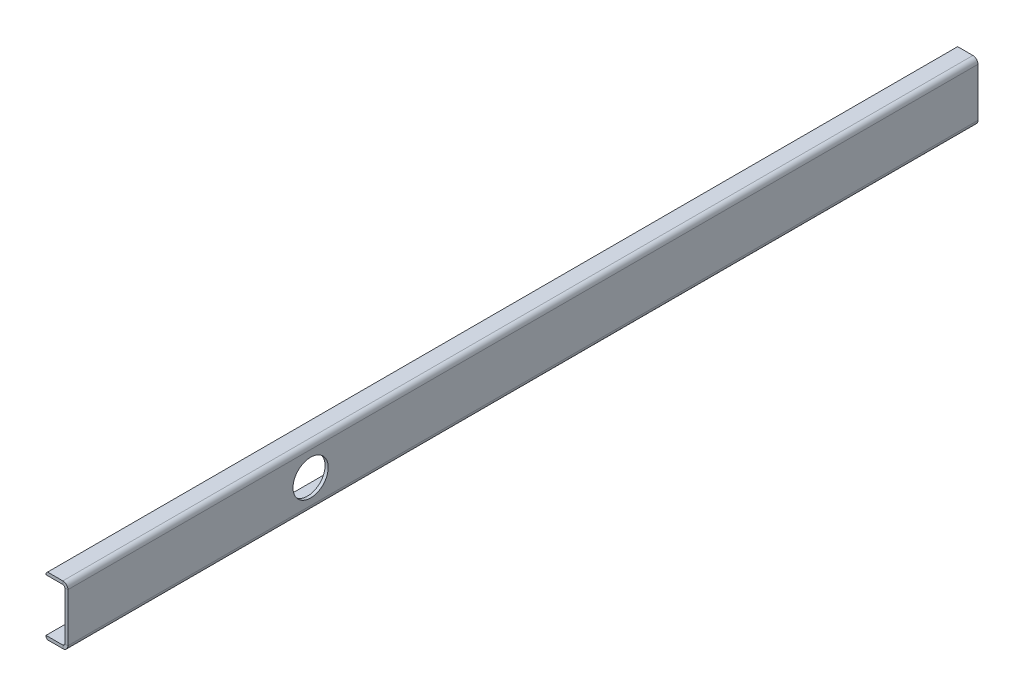
ISO-10303-21;
HEADER;
FILE_DESCRIPTION(('STEP AP214'),'2;1');
FILE_NAME('part.step','',(''),(''),'','','');
FILE_SCHEMA(('AUTOMOTIVE_DESIGN { 1 0 10303 214 1 1 1 1 }'));
ENDSEC;
DATA;
#1=APPLICATION_CONTEXT('core data for automotive mechanical design processes');
#2=APPLICATION_PROTOCOL_DEFINITION('international standard','automotive_design',2000,#1);
#3=PRODUCT_CONTEXT('',#1,'mechanical');
#4=PRODUCT('Part','Part','',(#3));
#5=PRODUCT_RELATED_PRODUCT_CATEGORY('part','',(#4));
#6=PRODUCT_DEFINITION_FORMATION('','',#4);
#7=PRODUCT_DEFINITION_CONTEXT('part definition',#1,'design');
#8=PRODUCT_DEFINITION('design','',#6,#7);
#9=PRODUCT_DEFINITION_SHAPE('','',#8);
#10=(LENGTH_UNIT() NAMED_UNIT(*) SI_UNIT(.MILLI.,.METRE.));
#11=(NAMED_UNIT(*) PLANE_ANGLE_UNIT() SI_UNIT($,.RADIAN.));
#12=(NAMED_UNIT(*) SI_UNIT($,.STERADIAN.) SOLID_ANGLE_UNIT());
#13=UNCERTAINTY_MEASURE_WITH_UNIT(LENGTH_MEASURE(1.E-05),#10,'distance_accuracy_value','');
#14=(GEOMETRIC_REPRESENTATION_CONTEXT(3) GLOBAL_UNCERTAINTY_ASSIGNED_CONTEXT((#13)) GLOBAL_UNIT_ASSIGNED_CONTEXT((#10,
#11,#12)) REPRESENTATION_CONTEXT('',''));
#15=CARTESIAN_POINT('',(0.,0.,0.));
#16=DIRECTION('',(0.,0.,1.));
#17=DIRECTION('',(1.,0.,0.));
#18=AXIS2_PLACEMENT_3D('',#15,#16,#17);
#19=CARTESIAN_POINT('',(56.,-13.,2325.));
#20=DIRECTION('',(0.,0.,1.));
#21=DIRECTION('',(1.,0.,0.));
#22=AXIS2_PLACEMENT_3D('',#19,#20,#21);
#23=PLANE('',#22);
#24=DIRECTION('',(-1.,0.,0.));
#25=VECTOR('',#24,1.);
#26=CARTESIAN_POINT('',(56.,-13.,2325.));
#27=LINE('',#26,#25);
#28=CARTESIAN_POINT('',(56.,-13.,2325.));
#29=VERTEX_POINT('',#28);
#30=CARTESIAN_POINT('',(48.,-13.,2325.));
#31=VERTEX_POINT('',#30);
#32=EDGE_CURVE('E184',#29,#31,#27,.T.);
#33=ORIENTED_EDGE('',*,*,#32,.F.);
#34=CARTESIAN_POINT('',(43.,-13.,2325.));
#35=DIRECTION('',(0.,0.,1.));
#36=DIRECTION('',(1.,0.,0.));
#37=AXIS2_PLACEMENT_3D('',#34,#35,#36);
#38=CIRCLE('',#37,13.);
#39=CARTESIAN_POINT('',(43.,0.,2325.));
#40=VERTEX_POINT('',#39);
#41=EDGE_CURVE('E293',#40,#29,#38,.F.);
#42=ORIENTED_EDGE('',*,*,#41,.F.);
#43=DIRECTION('',(0.,1.,0.));
#44=VECTOR('',#43,1.);
#45=CARTESIAN_POINT('',(43.,-8.,2325.));
#46=LINE('',#45,#44);
#47=CARTESIAN_POINT('',(43.,-8.,2325.));
#48=VERTEX_POINT('',#47);
#49=EDGE_CURVE('E181',#48,#40,#46,.T.);
#50=ORIENTED_EDGE('',*,*,#49,.F.);
#51=CARTESIAN_POINT('',(43.,-13.,2325.));
#52=DIRECTION('',(0.,0.,1.));
#53=DIRECTION('',(1.,0.,0.));
#54=AXIS2_PLACEMENT_3D('',#51,#52,#53);
#55=CIRCLE('',#54,5.);
#56=EDGE_CURVE('E284',#48,#31,#55,.F.);
#57=ORIENTED_EDGE('',*,*,#56,.T.);
#58=EDGE_LOOP('',(#33,#42,#50,#57));
#59=FACE_BOUND('',#58,.T.);
#60=ADVANCED_FACE('F38',(#59),#23,.T.);
#61=CARTESIAN_POINT('',(43.,-8.,2325.));
#62=DIRECTION('',(0.,0.,1.));
#63=DIRECTION('',(1.,0.,0.));
#64=AXIS2_PLACEMENT_3D('',#61,#62,#63);
#65=PLANE('',#64);
#66=DIRECTION('',(0.,-1.,0.));
#67=VECTOR('',#66,1.);
#68=CARTESIAN_POINT('',(56.,0.,2325.));
#69=LINE('',#68,#67);
#70=CARTESIAN_POINT('',(56.,-137.,2325.));
#71=VERTEX_POINT('',#70);
#72=EDGE_CURVE('E257',#29,#71,#69,.T.);
#73=ORIENTED_EDGE('',*,*,#72,.F.);
#74=ORIENTED_EDGE('',*,*,#32,.T.);
#75=DIRECTION('',(0.,-1.,0.));
#76=VECTOR('',#75,1.);
#77=CARTESIAN_POINT('',(48.,0.,2325.));
#78=LINE('',#77,#76);
#79=CARTESIAN_POINT('',(48.,-137.,2325.));
#80=VERTEX_POINT('',#79);
#81=EDGE_CURVE('E281',#31,#80,#78,.T.);
#82=ORIENTED_EDGE('',*,*,#81,.T.);
#83=DIRECTION('',(1.,0.,0.));
#84=VECTOR('',#83,1.);
#85=CARTESIAN_POINT('',(48.,-137.,2325.));
#86=LINE('',#85,#84);
#87=EDGE_CURVE('E174',#80,#71,#86,.T.);
#88=ORIENTED_EDGE('',*,*,#87,.T.);
#89=EDGE_LOOP('',(#73,#74,#82,#88));
#90=FACE_BOUND('',#89,.T.);
#91=ADVANCED_FACE('F331',(#90),#65,.T.);
#92=CARTESIAN_POINT('',(43.,0.,0.));
#93=DIRECTION('',(0.,0.,-1.));
#94=DIRECTION('',(-1.,0.,0.));
#95=AXIS2_PLACEMENT_3D('',#92,#93,#94);
#96=PLANE('',#95);
#97=DIRECTION('',(0.,-1.,0.));
#98=VECTOR('',#97,1.);
#99=CARTESIAN_POINT('',(43.,0.,0.));
#100=LINE('',#99,#98);
#101=CARTESIAN_POINT('',(43.,0.,0.));
#102=VERTEX_POINT('',#101);
#103=CARTESIAN_POINT('',(43.,-8.,0.));
#104=VERTEX_POINT('',#103);
#105=EDGE_CURVE('E179',#102,#104,#100,.T.);
#106=ORIENTED_EDGE('',*,*,#105,.F.);
#107=CARTESIAN_POINT('',(43.,-13.,0.));
#108=DIRECTION('',(0.,0.,1.));
#109=DIRECTION('',(1.,0.,0.));
#110=AXIS2_PLACEMENT_3D('',#107,#108,#109);
#111=CIRCLE('',#110,13.);
#112=CARTESIAN_POINT('',(56.,-13.,0.));
#113=VERTEX_POINT('',#112);
#114=EDGE_CURVE('E215',#102,#113,#111,.F.);
#115=ORIENTED_EDGE('',*,*,#114,.T.);
#116=DIRECTION('',(1.,0.,0.));
#117=VECTOR('',#116,1.);
#118=CARTESIAN_POINT('',(48.,-13.,0.));
#119=LINE('',#118,#117);
#120=CARTESIAN_POINT('',(48.,-13.,0.));
#121=VERTEX_POINT('',#120);
#122=EDGE_CURVE('E177',#121,#113,#119,.T.);
#123=ORIENTED_EDGE('',*,*,#122,.F.);
#124=CARTESIAN_POINT('',(43.,-13.,0.));
#125=DIRECTION('',(0.,0.,1.));
#126=DIRECTION('',(1.,0.,0.));
#127=AXIS2_PLACEMENT_3D('',#124,#125,#126);
#128=CIRCLE('',#127,5.);
#129=EDGE_CURVE('E213',#104,#121,#128,.F.);
#130=ORIENTED_EDGE('',*,*,#129,.F.);
#131=EDGE_LOOP('',(#106,#115,#123,#130));
#132=FACE_BOUND('',#131,.T.);
#133=ADVANCED_FACE('F337',(#132),#96,.T.);
#134=CARTESIAN_POINT('',(48.,-13.,0.));
#135=DIRECTION('',(0.,0.,-1.));
#136=DIRECTION('',(-1.,0.,0.));
#137=AXIS2_PLACEMENT_3D('',#134,#135,#136);
#138=PLANE('',#137);
#139=DIRECTION('',(0.,1.,0.));
#140=VECTOR('',#139,1.);
#141=CARTESIAN_POINT('',(0.,-8.,0.));
#142=LINE('',#141,#140);
#143=CARTESIAN_POINT('',(0.,-8.,0.));
#144=VERTEX_POINT('',#143);
#145=CARTESIAN_POINT('',(0.,-4.00000000000023,0.));
#146=VERTEX_POINT('',#145);
#147=EDGE_CURVE('E202',#144,#146,#142,.T.);
#148=ORIENTED_EDGE('',*,*,#147,.T.);
#149=DIRECTION('',(-0.707106781186548,-0.707106781186548,0.));
#150=VECTOR('',#149,1.);
#151=CARTESIAN_POINT('',(19.5000000000001,15.4999999999999,0.));
#152=LINE('',#151,#150);
#153=CARTESIAN_POINT('',(4.00000000000023,0.,0.));
#154=VERTEX_POINT('',#153);
#155=EDGE_CURVE('E60',#146,#154,#152,.F.);
#156=ORIENTED_EDGE('',*,*,#155,.T.);
#157=DIRECTION('',(1.,0.,0.));
#158=VECTOR('',#157,1.);
#159=CARTESIAN_POINT('',(0.,0.,0.));
#160=LINE('',#159,#158);
#161=EDGE_CURVE('E211',#154,#102,#160,.T.);
#162=ORIENTED_EDGE('',*,*,#161,.T.);
#163=ORIENTED_EDGE('',*,*,#105,.T.);
#164=DIRECTION('',(1.,0.,0.));
#165=VECTOR('',#164,1.);
#166=CARTESIAN_POINT('',(0.,-8.,0.));
#167=LINE('',#166,#165);
#168=EDGE_CURVE('E210',#144,#104,#167,.T.);
#169=ORIENTED_EDGE('',*,*,#168,.F.);
#170=EDGE_LOOP('',(#148,#156,#162,#163,#169));
#171=FACE_BOUND('',#170,.T.);
#172=ADVANCED_FACE('F208',(#171),#138,.T.);
#173=CARTESIAN_POINT('',(43.,-150.,2325.));
#174=DIRECTION('',(0.,0.,1.));
#175=DIRECTION('',(1.,0.,0.));
#176=AXIS2_PLACEMENT_3D('',#173,#174,#175);
#177=PLANE('',#176);
#178=DIRECTION('',(0.,1.,0.));
#179=VECTOR('',#178,1.);
#180=CARTESIAN_POINT('',(43.,-150.,2325.));
#181=LINE('',#180,#179);
#182=CARTESIAN_POINT('',(43.,-150.,2325.));
#183=VERTEX_POINT('',#182);
#184=CARTESIAN_POINT('',(43.,-142.,2325.));
#185=VERTEX_POINT('',#184);
#186=EDGE_CURVE('E154',#183,#185,#181,.T.);
#187=ORIENTED_EDGE('',*,*,#186,.F.);
#188=CARTESIAN_POINT('',(43.,-137.,2325.));
#189=DIRECTION('',(0.,0.,1.));
#190=DIRECTION('',(1.,0.,0.));
#191=AXIS2_PLACEMENT_3D('',#188,#189,#190);
#192=CIRCLE('',#191,13.);
#193=EDGE_CURVE('E297',#71,#183,#192,.F.);
#194=ORIENTED_EDGE('',*,*,#193,.F.);
#195=ORIENTED_EDGE('',*,*,#87,.F.);
#196=CARTESIAN_POINT('',(43.,-137.,2325.));
#197=DIRECTION('',(0.,0.,1.));
#198=DIRECTION('',(1.,0.,0.));
#199=AXIS2_PLACEMENT_3D('',#196,#197,#198);
#200=CIRCLE('',#199,5.);
#201=EDGE_CURVE('E229',#80,#185,#200,.F.);
#202=ORIENTED_EDGE('',*,*,#201,.T.);
#203=EDGE_LOOP('',(#187,#194,#195,#202));
#204=FACE_BOUND('',#203,.T.);
#205=ADVANCED_FACE('F369',(#204),#177,.T.);
#206=CARTESIAN_POINT('',(48.,-137.,2325.));
#207=DIRECTION('',(0.,0.,1.));
#208=DIRECTION('',(1.,0.,0.));
#209=AXIS2_PLACEMENT_3D('',#206,#207,#208);
#210=PLANE('',#209);
#211=DIRECTION('',(0.,1.,0.));
#212=VECTOR('',#211,1.);
#213=CARTESIAN_POINT('',(0.,-150.,2325.));
#214=LINE('',#213,#212);
#215=CARTESIAN_POINT('',(0.,-146.,2325.));
#216=VERTEX_POINT('',#215);
#217=CARTESIAN_POINT('',(0.,-142.,2325.));
#218=VERTEX_POINT('',#217);
#219=EDGE_CURVE('E137',#216,#218,#214,.T.);
#220=ORIENTED_EDGE('',*,*,#219,.F.);
#221=DIRECTION('',(-0.707106781186547,0.707106781186548,0.));
#222=VECTOR('',#221,1.);
#223=CARTESIAN_POINT('',(19.5,-165.5,2325.));
#224=LINE('',#223,#222);
#225=CARTESIAN_POINT('',(4.00000000000001,-150.,2325.));
#226=VERTEX_POINT('',#225);
#227=EDGE_CURVE('E192',#216,#226,#224,.F.);
#228=ORIENTED_EDGE('',*,*,#227,.T.);
#229=DIRECTION('',(-1.,0.,0.));
#230=VECTOR('',#229,1.);
#231=CARTESIAN_POINT('',(56.,-150.,2325.));
#232=LINE('',#231,#230);
#233=EDGE_CURVE('E148',#183,#226,#232,.T.);
#234=ORIENTED_EDGE('',*,*,#233,.F.);
#235=ORIENTED_EDGE('',*,*,#186,.T.);
#236=DIRECTION('',(-1.,0.,0.));
#237=VECTOR('',#236,1.);
#238=CARTESIAN_POINT('',(56.,-142.,2325.));
#239=LINE('',#238,#237);
#240=EDGE_CURVE('E149',#185,#218,#239,.T.);
#241=ORIENTED_EDGE('',*,*,#240,.T.);
#242=EDGE_LOOP('',(#220,#228,#234,#235,#241));
#243=FACE_BOUND('',#242,.T.);
#244=ADVANCED_FACE('F152',(#243),#210,.T.);
#245=CARTESIAN_POINT('',(56.,-137.,0.));
#246=DIRECTION('',(0.,0.,-1.));
#247=DIRECTION('',(-1.,0.,0.));
#248=AXIS2_PLACEMENT_3D('',#245,#246,#247);
#249=PLANE('',#248);
#250=DIRECTION('',(-1.,0.,0.));
#251=VECTOR('',#250,1.);
#252=CARTESIAN_POINT('',(56.,-137.,0.));
#253=LINE('',#252,#251);
#254=CARTESIAN_POINT('',(56.,-137.,0.));
#255=VERTEX_POINT('',#254);
#256=CARTESIAN_POINT('',(48.,-137.,0.));
#257=VERTEX_POINT('',#256);
#258=EDGE_CURVE('E166',#255,#257,#253,.T.);
#259=ORIENTED_EDGE('',*,*,#258,.F.);
#260=CARTESIAN_POINT('',(43.,-137.,0.));
#261=DIRECTION('',(0.,0.,1.));
#262=DIRECTION('',(1.,0.,0.));
#263=AXIS2_PLACEMENT_3D('',#260,#261,#262);
#264=CIRCLE('',#263,13.);
#265=CARTESIAN_POINT('',(43.,-150.,0.));
#266=VERTEX_POINT('',#265);
#267=EDGE_CURVE('E262',#255,#266,#264,.F.);
#268=ORIENTED_EDGE('',*,*,#267,.T.);
#269=DIRECTION('',(0.,-1.,0.));
#270=VECTOR('',#269,1.);
#271=CARTESIAN_POINT('',(43.,-142.,0.));
#272=LINE('',#271,#270);
#273=CARTESIAN_POINT('',(43.,-142.,0.));
#274=VERTEX_POINT('',#273);
#275=EDGE_CURVE('E163',#274,#266,#272,.T.);
#276=ORIENTED_EDGE('',*,*,#275,.F.);
#277=CARTESIAN_POINT('',(43.,-137.,0.));
#278=DIRECTION('',(0.,0.,1.));
#279=DIRECTION('',(1.,0.,0.));
#280=AXIS2_PLACEMENT_3D('',#277,#278,#279);
#281=CIRCLE('',#280,5.);
#282=EDGE_CURVE('E158',#257,#274,#281,.F.);
#283=ORIENTED_EDGE('',*,*,#282,.F.);
#284=EDGE_LOOP('',(#259,#268,#276,#283));
#285=FACE_BOUND('',#284,.T.);
#286=ADVANCED_FACE('F350',(#285),#249,.T.);
#287=CARTESIAN_POINT('',(43.,-142.,0.));
#288=DIRECTION('',(0.,0.,-1.));
#289=DIRECTION('',(-1.,0.,0.));
#290=AXIS2_PLACEMENT_3D('',#287,#288,#289);
#291=PLANE('',#290);
#292=DIRECTION('',(0.,-1.,0.));
#293=VECTOR('',#292,1.);
#294=CARTESIAN_POINT('',(56.,0.,0.));
#295=LINE('',#294,#293);
#296=EDGE_CURVE('E254',#113,#255,#295,.T.);
#297=ORIENTED_EDGE('',*,*,#296,.T.);
#298=ORIENTED_EDGE('',*,*,#258,.T.);
#299=DIRECTION('',(0.,-1.,0.));
#300=VECTOR('',#299,1.);
#301=CARTESIAN_POINT('',(48.,0.,0.));
#302=LINE('',#301,#300);
#303=EDGE_CURVE('E221',#121,#257,#302,.T.);
#304=ORIENTED_EDGE('',*,*,#303,.F.);
#305=ORIENTED_EDGE('',*,*,#122,.T.);
#306=EDGE_LOOP('',(#297,#298,#304,#305));
#307=FACE_BOUND('',#306,.T.);
#308=ADVANCED_FACE('F270',(#307),#291,.T.);
#309=CARTESIAN_POINT('',(56.,-142.,2325.));
#310=DIRECTION('',(0.,-1.,0.));
#311=DIRECTION('',(1.,0.,0.));
#312=AXIS2_PLACEMENT_3D('',#309,#310,#311);
#313=PLANE('',#312);
#314=DIRECTION('',(-1.,0.,0.));
#315=VECTOR('',#314,1.);
#316=CARTESIAN_POINT('',(56.,-142.,0.));
#317=LINE('',#316,#315);
#318=CARTESIAN_POINT('',(0.,-142.,0.));
#319=VERTEX_POINT('',#318);
#320=EDGE_CURVE('E162',#274,#319,#317,.T.);
#321=ORIENTED_EDGE('',*,*,#320,.T.);
#322=DIRECTION('',(0.,0.,-1.));
#323=VECTOR('',#322,1.);
#324=CARTESIAN_POINT('',(0.,-142.,2325.));
#325=LINE('',#324,#323);
#326=EDGE_CURVE('E142',#218,#319,#325,.T.);
#327=ORIENTED_EDGE('',*,*,#326,.F.);
#328=ORIENTED_EDGE('',*,*,#240,.F.);
#329=DIRECTION('',(0.,0.,-1.));
#330=VECTOR('',#329,1.);
#331=CARTESIAN_POINT('',(43.,-142.,2325.));
#332=LINE('',#331,#330);
#333=EDGE_CURVE('E226',#185,#274,#332,.T.);
#334=ORIENTED_EDGE('',*,*,#333,.T.);
#335=EDGE_LOOP('',(#321,#327,#328,#334));
#336=FACE_BOUND('',#335,.T.);
#337=ADVANCED_FACE('F160',(#336),#313,.F.);
#338=CARTESIAN_POINT('',(0.,-150.,2325.));
#339=DIRECTION('',(-1.,0.,0.));
#340=DIRECTION('',(0.,-1.,0.));
#341=AXIS2_PLACEMENT_3D('',#338,#339,#340);
#342=PLANE('',#341);
#343=DIRECTION('',(0.,1.,0.));
#344=VECTOR('',#343,1.);
#345=CARTESIAN_POINT('',(0.,-150.,0.));
#346=LINE('',#345,#344);
#347=CARTESIAN_POINT('',(0.,-146.,0.));
#348=VERTEX_POINT('',#347);
#349=EDGE_CURVE('E276',#348,#319,#346,.T.);
#350=ORIENTED_EDGE('',*,*,#349,.F.);
#351=DIRECTION('',(0.,0.,1.));
#352=VECTOR('',#351,1.);
#353=CARTESIAN_POINT('',(0.,-146.,2325.));
#354=LINE('',#353,#352);
#355=EDGE_CURVE('E145',#348,#216,#354,.T.);
#356=ORIENTED_EDGE('',*,*,#355,.T.);
#357=ORIENTED_EDGE('',*,*,#219,.T.);
#358=ORIENTED_EDGE('',*,*,#326,.T.);
#359=EDGE_LOOP('',(#350,#356,#357,#358));
#360=FACE_BOUND('',#359,.T.);
#361=ADVANCED_FACE('F140',(#360),#342,.T.);
#362=CARTESIAN_POINT('',(56.,-150.,2325.));
#363=DIRECTION('',(0.,-1.,0.));
#364=DIRECTION('',(1.,0.,0.));
#365=AXIS2_PLACEMENT_3D('',#362,#363,#364);
#366=PLANE('',#365);
#367=ORIENTED_EDGE('',*,*,#233,.T.);
#368=DIRECTION('',(0.,0.,-1.));
#369=VECTOR('',#368,1.);
#370=CARTESIAN_POINT('',(4.00000000000001,-150.,2325.));
#371=LINE('',#370,#369);
#372=CARTESIAN_POINT('',(4.00000000000001,-150.,0.));
#373=VERTEX_POINT('',#372);
#374=EDGE_CURVE('E186',#226,#373,#371,.T.);
#375=ORIENTED_EDGE('',*,*,#374,.T.);
#376=DIRECTION('',(-1.,0.,0.));
#377=VECTOR('',#376,1.);
#378=CARTESIAN_POINT('',(56.,-150.,0.));
#379=LINE('',#378,#377);
#380=EDGE_CURVE('E267',#266,#373,#379,.T.);
#381=ORIENTED_EDGE('',*,*,#380,.F.);
#382=DIRECTION('',(0.,0.,-1.));
#383=VECTOR('',#382,1.);
#384=CARTESIAN_POINT('',(43.,-150.,2325.));
#385=LINE('',#384,#383);
#386=EDGE_CURVE('E164',#183,#266,#385,.T.);
#387=ORIENTED_EDGE('',*,*,#386,.F.);
#388=EDGE_LOOP('',(#367,#375,#381,#387));
#389=FACE_BOUND('',#388,.T.);
#390=ADVANCED_FACE('F328',(#389),#366,.T.);
#391=CARTESIAN_POINT('',(43.,-137.,2325.));
#392=DIRECTION('',(0.,0.,-1.));
#393=DIRECTION('',(-1.,0.,0.));
#394=AXIS2_PLACEMENT_3D('',#391,#392,#393);
#395=CYLINDRICAL_SURFACE('',#394,13.);
#396=ORIENTED_EDGE('',*,*,#267,.F.);
#397=DIRECTION('',(0.,0.,-1.));
#398=VECTOR('',#397,1.);
#399=CARTESIAN_POINT('',(56.,-137.,2325.));
#400=LINE('',#399,#398);
#401=EDGE_CURVE('E169',#71,#255,#400,.T.);
#402=ORIENTED_EDGE('',*,*,#401,.F.);
#403=ORIENTED_EDGE('',*,*,#193,.T.);
#404=ORIENTED_EDGE('',*,*,#386,.T.);
#405=EDGE_LOOP('',(#396,#402,#403,#404));
#406=FACE_BOUND('',#405,.T.);
#407=ADVANCED_FACE('F263',(#406),#395,.T.);
#408=CARTESIAN_POINT('',(56.,0.,2325.));
#409=DIRECTION('',(1.,0.,0.));
#410=DIRECTION('',(0.,1.,0.));
#411=AXIS2_PLACEMENT_3D('',#408,#409,#410);
#412=PLANE('',#411);
#413=CARTESIAN_POINT('',(56.,-75.,1705.));
#414=DIRECTION('',(1.,0.,0.));
#415=DIRECTION('',(0.,1.,0.));
#416=AXIS2_PLACEMENT_3D('',#413,#414,#415);
#417=CIRCLE('',#416,45.);
#418=CARTESIAN_POINT('',(56.,-30.,1705.));
#419=VERTEX_POINT('',#418);
#420=EDGE_CURVE('E301',#419,#419,#417,.T.);
#421=ORIENTED_EDGE('',*,*,#420,.F.);
#422=EDGE_LOOP('',(#421));
#423=FACE_BOUND('',#422,.T.);
#424=ORIENTED_EDGE('',*,*,#296,.F.);
#425=DIRECTION('',(0.,0.,-1.));
#426=VECTOR('',#425,1.);
#427=CARTESIAN_POINT('',(56.,-13.,2325.));
#428=LINE('',#427,#426);
#429=EDGE_CURVE('E243',#29,#113,#428,.T.);
#430=ORIENTED_EDGE('',*,*,#429,.F.);
#431=ORIENTED_EDGE('',*,*,#72,.T.);
#432=ORIENTED_EDGE('',*,*,#401,.T.);
#433=EDGE_LOOP('',(#424,#430,#431,#432));
#434=FACE_BOUND('',#433,.T.);
#435=ADVANCED_FACE('F251',(#423,#434),#412,.T.);
#436=CARTESIAN_POINT('',(43.,-13.,2325.));
#437=DIRECTION('',(0.,0.,-1.));
#438=DIRECTION('',(-1.,0.,0.));
#439=AXIS2_PLACEMENT_3D('',#436,#437,#438);
#440=CYLINDRICAL_SURFACE('',#439,13.);
#441=ORIENTED_EDGE('',*,*,#114,.F.);
#442=DIRECTION('',(0.,0.,-1.));
#443=VECTOR('',#442,1.);
#444=CARTESIAN_POINT('',(43.,0.,2325.));
#445=LINE('',#444,#443);
#446=EDGE_CURVE('E240',#40,#102,#445,.T.);
#447=ORIENTED_EDGE('',*,*,#446,.F.);
#448=ORIENTED_EDGE('',*,*,#41,.T.);
#449=ORIENTED_EDGE('',*,*,#429,.T.);
#450=EDGE_LOOP('',(#441,#447,#448,#449));
#451=FACE_BOUND('',#450,.T.);
#452=ADVANCED_FACE('F319',(#451),#440,.T.);
#453=CARTESIAN_POINT('',(0.,0.,2325.));
#454=DIRECTION('',(0.,1.,0.));
#455=DIRECTION('',(0.,0.,1.));
#456=AXIS2_PLACEMENT_3D('',#453,#454,#455);
#457=PLANE('',#456);
#458=ORIENTED_EDGE('',*,*,#161,.F.);
#459=DIRECTION('',(0.,0.,1.));
#460=VECTOR('',#459,1.);
#461=CARTESIAN_POINT('',(4.00000000000023,0.,2325.));
#462=LINE('',#461,#460);
#463=CARTESIAN_POINT('',(4.00000000000023,0.,2325.));
#464=VERTEX_POINT('',#463);
#465=EDGE_CURVE('E46',#154,#464,#462,.T.);
#466=ORIENTED_EDGE('',*,*,#465,.T.);
#467=DIRECTION('',(1.,0.,0.));
#468=VECTOR('',#467,1.);
#469=CARTESIAN_POINT('',(0.,0.,2325.));
#470=LINE('',#469,#468);
#471=EDGE_CURVE('E291',#464,#40,#470,.T.);
#472=ORIENTED_EDGE('',*,*,#471,.T.);
#473=ORIENTED_EDGE('',*,*,#446,.T.);
#474=EDGE_LOOP('',(#458,#466,#472,#473));
#475=FACE_BOUND('',#474,.T.);
#476=ADVANCED_FACE('F325',(#475),#457,.T.);
#477=CARTESIAN_POINT('',(0.,-8.,2325.));
#478=DIRECTION('',(-1.,0.,0.));
#479=DIRECTION('',(0.,0.,1.));
#480=AXIS2_PLACEMENT_3D('',#477,#478,#479);
#481=PLANE('',#480);
#482=DIRECTION('',(0.,1.,0.));
#483=VECTOR('',#482,1.);
#484=CARTESIAN_POINT('',(0.,-8.,2325.));
#485=LINE('',#484,#483);
#486=CARTESIAN_POINT('',(0.,-8.,2325.));
#487=VERTEX_POINT('',#486);
#488=CARTESIAN_POINT('',(0.,-4.00000000000023,2325.));
#489=VERTEX_POINT('',#488);
#490=EDGE_CURVE('E204',#487,#489,#485,.T.);
#491=ORIENTED_EDGE('',*,*,#490,.T.);
#492=DIRECTION('',(0.,0.,-1.));
#493=VECTOR('',#492,1.);
#494=CARTESIAN_POINT('',(0.,-4.00000000000023,2325.));
#495=LINE('',#494,#493);
#496=EDGE_CURVE('E194',#489,#146,#495,.T.);
#497=ORIENTED_EDGE('',*,*,#496,.T.);
#498=ORIENTED_EDGE('',*,*,#147,.F.);
#499=DIRECTION('',(0.,0.,-1.));
#500=VECTOR('',#499,1.);
#501=CARTESIAN_POINT('',(0.,-8.,2325.));
#502=LINE('',#501,#500);
#503=EDGE_CURVE('E238',#487,#144,#502,.T.);
#504=ORIENTED_EDGE('',*,*,#503,.F.);
#505=EDGE_LOOP('',(#491,#497,#498,#504));
#506=FACE_BOUND('',#505,.T.);
#507=ADVANCED_FACE('F201',(#506),#481,.T.);
#508=CARTESIAN_POINT('',(0.,-8.,2325.));
#509=DIRECTION('',(0.,1.,0.));
#510=DIRECTION('',(0.,0.,1.));
#511=AXIS2_PLACEMENT_3D('',#508,#509,#510);
#512=PLANE('',#511);
#513=ORIENTED_EDGE('',*,*,#168,.T.);
#514=DIRECTION('',(0.,0.,-1.));
#515=VECTOR('',#514,1.);
#516=CARTESIAN_POINT('',(43.,-8.,2325.));
#517=LINE('',#516,#515);
#518=EDGE_CURVE('E235',#48,#104,#517,.T.);
#519=ORIENTED_EDGE('',*,*,#518,.F.);
#520=DIRECTION('',(1.,0.,0.));
#521=VECTOR('',#520,1.);
#522=CARTESIAN_POINT('',(0.,-8.,2325.));
#523=LINE('',#522,#521);
#524=EDGE_CURVE('E287',#487,#48,#523,.T.);
#525=ORIENTED_EDGE('',*,*,#524,.F.);
#526=ORIENTED_EDGE('',*,*,#503,.T.);
#527=EDGE_LOOP('',(#513,#519,#525,#526));
#528=FACE_BOUND('',#527,.T.);
#529=ADVANCED_FACE('F443',(#528),#512,.F.);
#530=CARTESIAN_POINT('',(43.,-13.,2325.));
#531=DIRECTION('',(0.,0.,-1.));
#532=DIRECTION('',(-1.,0.,0.));
#533=AXIS2_PLACEMENT_3D('',#530,#531,#532);
#534=CYLINDRICAL_SURFACE('',#533,5.);
#535=ORIENTED_EDGE('',*,*,#129,.T.);
#536=DIRECTION('',(0.,0.,-1.));
#537=VECTOR('',#536,1.);
#538=CARTESIAN_POINT('',(48.,-13.,2325.));
#539=LINE('',#538,#537);
#540=EDGE_CURVE('E232',#31,#121,#539,.T.);
#541=ORIENTED_EDGE('',*,*,#540,.F.);
#542=ORIENTED_EDGE('',*,*,#56,.F.);
#543=ORIENTED_EDGE('',*,*,#518,.T.);
#544=EDGE_LOOP('',(#535,#541,#542,#543));
#545=FACE_BOUND('',#544,.T.);
#546=ADVANCED_FACE('F360',(#545),#534,.F.);
#547=CARTESIAN_POINT('',(48.,0.,2325.));
#548=DIRECTION('',(1.,0.,0.));
#549=DIRECTION('',(0.,1.,0.));
#550=AXIS2_PLACEMENT_3D('',#547,#548,#549);
#551=PLANE('',#550);
#552=CARTESIAN_POINT('',(48.,-75.,1705.));
#553=DIRECTION('',(1.,0.,0.));
#554=DIRECTION('',(0.,1.,0.));
#555=AXIS2_PLACEMENT_3D('',#552,#553,#554);
#556=CIRCLE('',#555,45.);
#557=CARTESIAN_POINT('',(48.,-30.,1705.));
#558=VERTEX_POINT('',#557);
#559=EDGE_CURVE('E279',#558,#558,#556,.T.);
#560=ORIENTED_EDGE('',*,*,#559,.T.);
#561=EDGE_LOOP('',(#560));
#562=FACE_BOUND('',#561,.T.);
#563=ORIENTED_EDGE('',*,*,#303,.T.);
#564=DIRECTION('',(0.,0.,-1.));
#565=VECTOR('',#564,1.);
#566=CARTESIAN_POINT('',(48.,-137.,2325.));
#567=LINE('',#566,#565);
#568=EDGE_CURVE('E228',#80,#257,#567,.T.);
#569=ORIENTED_EDGE('',*,*,#568,.F.);
#570=ORIENTED_EDGE('',*,*,#81,.F.);
#571=ORIENTED_EDGE('',*,*,#540,.T.);
#572=EDGE_LOOP('',(#563,#569,#570,#571));
#573=FACE_BOUND('',#572,.T.);
#574=ADVANCED_FACE('F307',(#562,#573),#551,.F.);
#575=CARTESIAN_POINT('',(43.,-137.,2325.));
#576=DIRECTION('',(0.,0.,-1.));
#577=DIRECTION('',(-1.,0.,0.));
#578=AXIS2_PLACEMENT_3D('',#575,#576,#577);
#579=CYLINDRICAL_SURFACE('',#578,5.);
#580=ORIENTED_EDGE('',*,*,#282,.T.);
#581=ORIENTED_EDGE('',*,*,#333,.F.);
#582=ORIENTED_EDGE('',*,*,#201,.F.);
#583=ORIENTED_EDGE('',*,*,#568,.T.);
#584=EDGE_LOOP('',(#580,#581,#582,#583));
#585=FACE_BOUND('',#584,.T.);
#586=ADVANCED_FACE('F353',(#585),#579,.F.);
#587=CARTESIAN_POINT('',(43.,-137.,2325.));
#588=DIRECTION('',(0.,0.,1.));
#589=DIRECTION('',(1.,0.,0.));
#590=AXIS2_PLACEMENT_3D('',#587,#588,#589);
#591=PLANE('',#590);
#592=ORIENTED_EDGE('',*,*,#471,.F.);
#593=DIRECTION('',(0.707106781186548,0.707106781186548,0.));
#594=VECTOR('',#593,1.);
#595=CARTESIAN_POINT('',(-44.9999999999999,-49.0000000000001,2325.));
#596=LINE('',#595,#594);
#597=EDGE_CURVE('E11',#464,#489,#596,.F.);
#598=ORIENTED_EDGE('',*,*,#597,.T.);
#599=ORIENTED_EDGE('',*,*,#490,.F.);
#600=ORIENTED_EDGE('',*,*,#524,.T.);
#601=ORIENTED_EDGE('',*,*,#49,.T.);
#602=EDGE_LOOP('',(#592,#598,#599,#600,#601));
#603=FACE_BOUND('',#602,.T.);
#604=ADVANCED_FACE('F451',(#603),#591,.T.);
#605=CARTESIAN_POINT('',(43.,-137.,0.));
#606=DIRECTION('',(0.,0.,1.));
#607=DIRECTION('',(1.,0.,0.));
#608=AXIS2_PLACEMENT_3D('',#605,#606,#607);
#609=PLANE('',#608);
#610=ORIENTED_EDGE('',*,*,#380,.T.);
#611=DIRECTION('',(0.707106781186547,-0.707106781186548,0.));
#612=VECTOR('',#611,1.);
#613=CARTESIAN_POINT('',(4.00000000000001,-150.,0.));
#614=LINE('',#613,#612);
#615=EDGE_CURVE('E189',#373,#348,#614,.F.);
#616=ORIENTED_EDGE('',*,*,#615,.T.);
#617=ORIENTED_EDGE('',*,*,#349,.T.);
#618=ORIENTED_EDGE('',*,*,#320,.F.);
#619=ORIENTED_EDGE('',*,*,#275,.T.);
#620=EDGE_LOOP('',(#610,#616,#617,#618,#619));
#621=FACE_BOUND('',#620,.T.);
#622=ADVANCED_FACE('F314',(#621),#609,.F.);
#623=CARTESIAN_POINT('',(48.,-75.,1705.));
#624=DIRECTION('',(1.,0.,0.));
#625=DIRECTION('',(0.,1.,0.));
#626=AXIS2_PLACEMENT_3D('',#623,#624,#625);
#627=CYLINDRICAL_SURFACE('',#626,45.);
#628=ORIENTED_EDGE('',*,*,#559,.F.);
#629=EDGE_LOOP('',(#628));
#630=FACE_BOUND('',#629,.T.);
#631=ORIENTED_EDGE('',*,*,#420,.T.);
#632=EDGE_LOOP('',(#631));
#633=FACE_BOUND('',#632,.T.);
#634=ADVANCED_FACE('F310',(#630,#633),#627,.F.);
#635=CARTESIAN_POINT('',(4.00000000000001,-150.,2325.));
#636=DIRECTION('',(0.707106781186548,0.707106781186547,0.));
#637=DIRECTION('',(0.,0.,-1.));
#638=AXIS2_PLACEMENT_3D('',#635,#636,#637);
#639=PLANE('',#638);
#640=ORIENTED_EDGE('',*,*,#227,.F.);
#641=ORIENTED_EDGE('',*,*,#355,.F.);
#642=ORIENTED_EDGE('',*,*,#615,.F.);
#643=ORIENTED_EDGE('',*,*,#374,.F.);
#644=EDGE_LOOP('',(#640,#641,#642,#643));
#645=FACE_BOUND('',#644,.T.);
#646=ADVANCED_FACE('F313',(#645),#639,.F.);
#647=CARTESIAN_POINT('',(0.,-4.00000000000023,2325.));
#648=DIRECTION('',(0.707106781186548,-0.707106781186548,0.));
#649=DIRECTION('',(0.,0.,-1.));
#650=AXIS2_PLACEMENT_3D('',#647,#648,#649);
#651=PLANE('',#650);
#652=ORIENTED_EDGE('',*,*,#597,.F.);
#653=ORIENTED_EDGE('',*,*,#465,.F.);
#654=ORIENTED_EDGE('',*,*,#155,.F.);
#655=ORIENTED_EDGE('',*,*,#496,.F.);
#656=EDGE_LOOP('',(#652,#653,#654,#655));
#657=FACE_BOUND('',#656,.T.);
#658=ADVANCED_FACE('F40',(#657),#651,.F.);
#659=CLOSED_SHELL('',(#60,#91,#133,#172,#205,#244,#286,#308,#337,#361,#390,#407,#435,#452,#476,
#507,#529,#546,#574,#586,#604,#622,#634,#646,#658));
#660=MANIFOLD_SOLID_BREP('B2',#659);
#661=ADVANCED_BREP_SHAPE_REPRESENTATION('',(#18,#660),#14);
#662=SHAPE_DEFINITION_REPRESENTATION(#9,#661);
ENDSEC;
END-ISO-10303-21;
